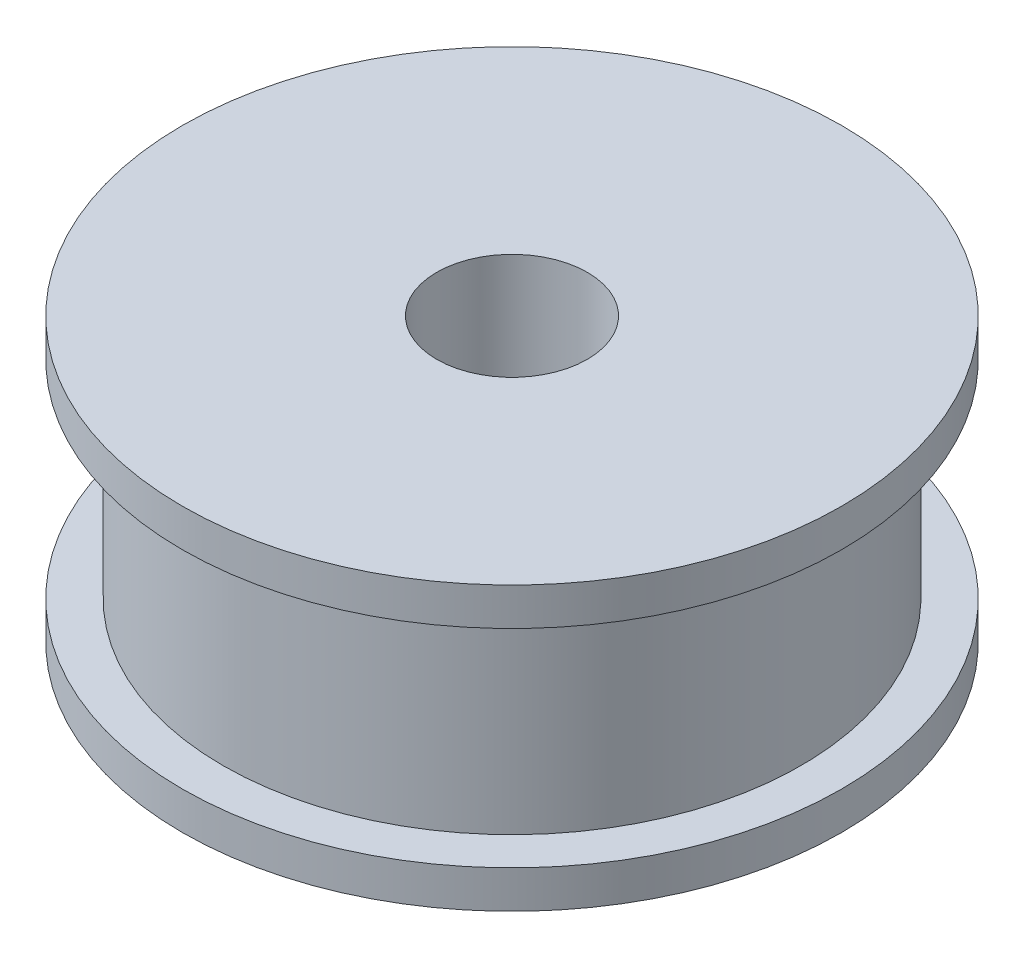
ISO-10303-21;
HEADER;
FILE_DESCRIPTION(('STEP AP214'),'2;1');
FILE_NAME('part.step','',(''),(''),'','','');
FILE_SCHEMA(('AUTOMOTIVE_DESIGN { 1 0 10303 214 1 1 1 1 }'));
ENDSEC;
DATA;
#1=APPLICATION_CONTEXT('core data for automotive mechanical design processes');
#2=APPLICATION_PROTOCOL_DEFINITION('international standard','automotive_design',2000,#1);
#3=PRODUCT_CONTEXT('',#1,'mechanical');
#4=PRODUCT('Part','Part','',(#3));
#5=PRODUCT_RELATED_PRODUCT_CATEGORY('part','',(#4));
#6=PRODUCT_DEFINITION_FORMATION('','',#4);
#7=PRODUCT_DEFINITION_CONTEXT('part definition',#1,'design');
#8=PRODUCT_DEFINITION('design','',#6,#7);
#9=PRODUCT_DEFINITION_SHAPE('','',#8);
#10=(LENGTH_UNIT() NAMED_UNIT(*) SI_UNIT(.MILLI.,.METRE.));
#11=(NAMED_UNIT(*) PLANE_ANGLE_UNIT() SI_UNIT($,.RADIAN.));
#12=(NAMED_UNIT(*) SI_UNIT($,.STERADIAN.) SOLID_ANGLE_UNIT());
#13=UNCERTAINTY_MEASURE_WITH_UNIT(LENGTH_MEASURE(1.E-05),#10,'distance_accuracy_value','');
#14=(GEOMETRIC_REPRESENTATION_CONTEXT(3) GLOBAL_UNCERTAINTY_ASSIGNED_CONTEXT((#13)) GLOBAL_UNIT_ASSIGNED_CONTEXT((#10,
#11,#12)) REPRESENTATION_CONTEXT('',''));
#15=CARTESIAN_POINT('',(0.,0.,0.));
#16=DIRECTION('',(0.,0.,1.));
#17=DIRECTION('',(1.,0.,0.));
#18=AXIS2_PLACEMENT_3D('',#15,#16,#17);
#19=CARTESIAN_POINT('',(0.,11.,0.));
#20=DIRECTION('',(0.,-1.,0.));
#21=DIRECTION('',(0.,0.,-1.));
#22=AXIS2_PLACEMENT_3D('',#19,#20,#21);
#23=CYLINDRICAL_SURFACE('',#22,15.345);
#24=CARTESIAN_POINT('',(0.,11.,0.));
#25=DIRECTION('',(0.,1.,0.));
#26=DIRECTION('',(0.,0.,1.));
#27=AXIS2_PLACEMENT_3D('',#24,#25,#26);
#28=CIRCLE('',#27,15.345);
#29=CARTESIAN_POINT('',(0.,11.,15.345));
#30=VERTEX_POINT('',#29);
#31=EDGE_CURVE('E10',#30,#30,#28,.T.);
#32=ORIENTED_EDGE('',*,*,#31,.F.);
#33=EDGE_LOOP('',(#32));
#34=FACE_BOUND('',#33,.T.);
#35=CARTESIAN_POINT('',(0.,0.,0.));
#36=DIRECTION('',(0.,1.,0.));
#37=DIRECTION('',(0.,0.,1.));
#38=AXIS2_PLACEMENT_3D('',#35,#36,#37);
#39=CIRCLE('',#38,15.345);
#40=CARTESIAN_POINT('',(0.,0.,15.345));
#41=VERTEX_POINT('',#40);
#42=EDGE_CURVE('E42',#41,#41,#39,.T.);
#43=ORIENTED_EDGE('',*,*,#42,.T.);
#44=EDGE_LOOP('',(#43));
#45=FACE_BOUND('',#44,.T.);
#46=ADVANCED_FACE('F39',(#34,#45),#23,.T.);
#47=CARTESIAN_POINT('',(0.,11.,0.));
#48=DIRECTION('',(0.,-1.,0.));
#49=DIRECTION('',(0.,0.,-1.));
#50=AXIS2_PLACEMENT_3D('',#47,#48,#49);
#51=CYLINDRICAL_SURFACE('',#50,4.);
#52=CARTESIAN_POINT('',(0.,13.,0.));
#53=DIRECTION('',(0.,1.,0.));
#54=DIRECTION('',(0.,0.,1.));
#55=AXIS2_PLACEMENT_3D('',#52,#53,#54);
#56=CIRCLE('',#55,4.);
#57=CARTESIAN_POINT('',(0.,13.,4.));
#58=VERTEX_POINT('',#57);
#59=EDGE_CURVE('E54',#58,#58,#56,.T.);
#60=ORIENTED_EDGE('',*,*,#59,.T.);
#61=EDGE_LOOP('',(#60));
#62=FACE_BOUND('',#61,.T.);
#63=CARTESIAN_POINT('',(0.,-2.,0.));
#64=DIRECTION('',(0.,-1.,0.));
#65=DIRECTION('',(0.,0.,-1.));
#66=AXIS2_PLACEMENT_3D('',#63,#64,#65);
#67=CIRCLE('',#66,4.);
#68=CARTESIAN_POINT('',(0.,-2.,-4.));
#69=VERTEX_POINT('',#68);
#70=EDGE_CURVE('E62',#69,#69,#67,.T.);
#71=ORIENTED_EDGE('',*,*,#70,.T.);
#72=EDGE_LOOP('',(#71));
#73=FACE_BOUND('',#72,.T.);
#74=ADVANCED_FACE('F68',(#62,#73),#51,.F.);
#75=CARTESIAN_POINT('',(0.,13.,0.));
#76=DIRECTION('',(0.,1.,0.));
#77=DIRECTION('',(0.,0.,1.));
#78=AXIS2_PLACEMENT_3D('',#75,#76,#77);
#79=PLANE('',#78);
#80=CARTESIAN_POINT('',(0.,13.,0.));
#81=DIRECTION('',(0.,1.,0.));
#82=DIRECTION('',(0.,0.,1.));
#83=AXIS2_PLACEMENT_3D('',#80,#81,#82);
#84=CIRCLE('',#83,17.5);
#85=CARTESIAN_POINT('',(0.,13.,17.5));
#86=VERTEX_POINT('',#85);
#87=EDGE_CURVE('E46',#86,#86,#84,.T.);
#88=ORIENTED_EDGE('',*,*,#87,.T.);
#89=EDGE_LOOP('',(#88));
#90=FACE_BOUND('',#89,.T.);
#91=ORIENTED_EDGE('',*,*,#59,.F.);
#92=EDGE_LOOP('',(#91));
#93=FACE_BOUND('',#92,.T.);
#94=ADVANCED_FACE('F92',(#90,#93),#79,.T.);
#95=CARTESIAN_POINT('',(0.,11.,0.));
#96=DIRECTION('',(0.,1.,0.));
#97=DIRECTION('',(0.,0.,1.));
#98=AXIS2_PLACEMENT_3D('',#95,#96,#97);
#99=PLANE('',#98);
#100=ORIENTED_EDGE('',*,*,#31,.T.);
#101=EDGE_LOOP('',(#100));
#102=FACE_BOUND('',#101,.T.);
#103=CARTESIAN_POINT('',(0.,11.,0.));
#104=DIRECTION('',(0.,1.,0.));
#105=DIRECTION('',(0.,0.,1.));
#106=AXIS2_PLACEMENT_3D('',#103,#104,#105);
#107=CIRCLE('',#106,17.5);
#108=CARTESIAN_POINT('',(0.,11.,17.5));
#109=VERTEX_POINT('',#108);
#110=EDGE_CURVE('E50',#109,#109,#107,.T.);
#111=ORIENTED_EDGE('',*,*,#110,.F.);
#112=EDGE_LOOP('',(#111));
#113=FACE_BOUND('',#112,.T.);
#114=ADVANCED_FACE('F84',(#102,#113),#99,.F.);
#115=CARTESIAN_POINT('',(0.,13.,0.));
#116=DIRECTION('',(0.,-1.,0.));
#117=DIRECTION('',(0.,0.,-1.));
#118=AXIS2_PLACEMENT_3D('',#115,#116,#117);
#119=CYLINDRICAL_SURFACE('',#118,17.5);
#120=ORIENTED_EDGE('',*,*,#87,.F.);
#121=EDGE_LOOP('',(#120));
#122=FACE_BOUND('',#121,.T.);
#123=ORIENTED_EDGE('',*,*,#110,.T.);
#124=EDGE_LOOP('',(#123));
#125=FACE_BOUND('',#124,.T.);
#126=ADVANCED_FACE('F73',(#122,#125),#119,.T.);
#127=CARTESIAN_POINT('',(0.,-2.,0.));
#128=DIRECTION('',(0.,-1.,0.));
#129=DIRECTION('',(0.,0.,-1.));
#130=AXIS2_PLACEMENT_3D('',#127,#128,#129);
#131=PLANE('',#130);
#132=CARTESIAN_POINT('',(0.,-2.,0.));
#133=DIRECTION('',(0.,-1.,0.));
#134=DIRECTION('',(0.,0.,-1.));
#135=AXIS2_PLACEMENT_3D('',#132,#133,#134);
#136=CIRCLE('',#135,17.5);
#137=CARTESIAN_POINT('',(0.,-2.,-17.5));
#138=VERTEX_POINT('',#137);
#139=EDGE_CURVE('E61',#138,#138,#136,.T.);
#140=ORIENTED_EDGE('',*,*,#139,.T.);
#141=EDGE_LOOP('',(#140));
#142=FACE_BOUND('',#141,.T.);
#143=ORIENTED_EDGE('',*,*,#70,.F.);
#144=EDGE_LOOP('',(#143));
#145=FACE_BOUND('',#144,.T.);
#146=ADVANCED_FACE('F70',(#142,#145),#131,.T.);
#147=CARTESIAN_POINT('',(0.,0.,0.));
#148=DIRECTION('',(0.,-1.,0.));
#149=DIRECTION('',(0.,0.,-1.));
#150=AXIS2_PLACEMENT_3D('',#147,#148,#149);
#151=PLANE('',#150);
#152=ORIENTED_EDGE('',*,*,#42,.F.);
#153=EDGE_LOOP('',(#152));
#154=FACE_BOUND('',#153,.T.);
#155=CARTESIAN_POINT('',(0.,0.,0.));
#156=DIRECTION('',(0.,-1.,0.));
#157=DIRECTION('',(0.,0.,-1.));
#158=AXIS2_PLACEMENT_3D('',#155,#156,#157);
#159=CIRCLE('',#158,17.5);
#160=CARTESIAN_POINT('',(0.,0.,-17.5));
#161=VERTEX_POINT('',#160);
#162=EDGE_CURVE('E58',#161,#161,#159,.T.);
#163=ORIENTED_EDGE('',*,*,#162,.F.);
#164=EDGE_LOOP('',(#163));
#165=FACE_BOUND('',#164,.T.);
#166=ADVANCED_FACE('F72',(#154,#165),#151,.F.);
#167=CARTESIAN_POINT('',(0.,-2.,0.));
#168=DIRECTION('',(0.,1.,0.));
#169=DIRECTION('',(0.,0.,1.));
#170=AXIS2_PLACEMENT_3D('',#167,#168,#169);
#171=CYLINDRICAL_SURFACE('',#170,17.5);
#172=ORIENTED_EDGE('',*,*,#139,.F.);
#173=EDGE_LOOP('',(#172));
#174=FACE_BOUND('',#173,.T.);
#175=ORIENTED_EDGE('',*,*,#162,.T.);
#176=EDGE_LOOP('',(#175));
#177=FACE_BOUND('',#176,.T.);
#178=ADVANCED_FACE('F80',(#174,#177),#171,.T.);
#179=CLOSED_SHELL('',(#46,#74,#94,#114,#126,#146,#166,#178));
#180=MANIFOLD_SOLID_BREP('B2',#179);
#181=ADVANCED_BREP_SHAPE_REPRESENTATION('',(#18,#180),#14);
#182=SHAPE_DEFINITION_REPRESENTATION(#9,#181);
ENDSEC;
END-ISO-10303-21;
